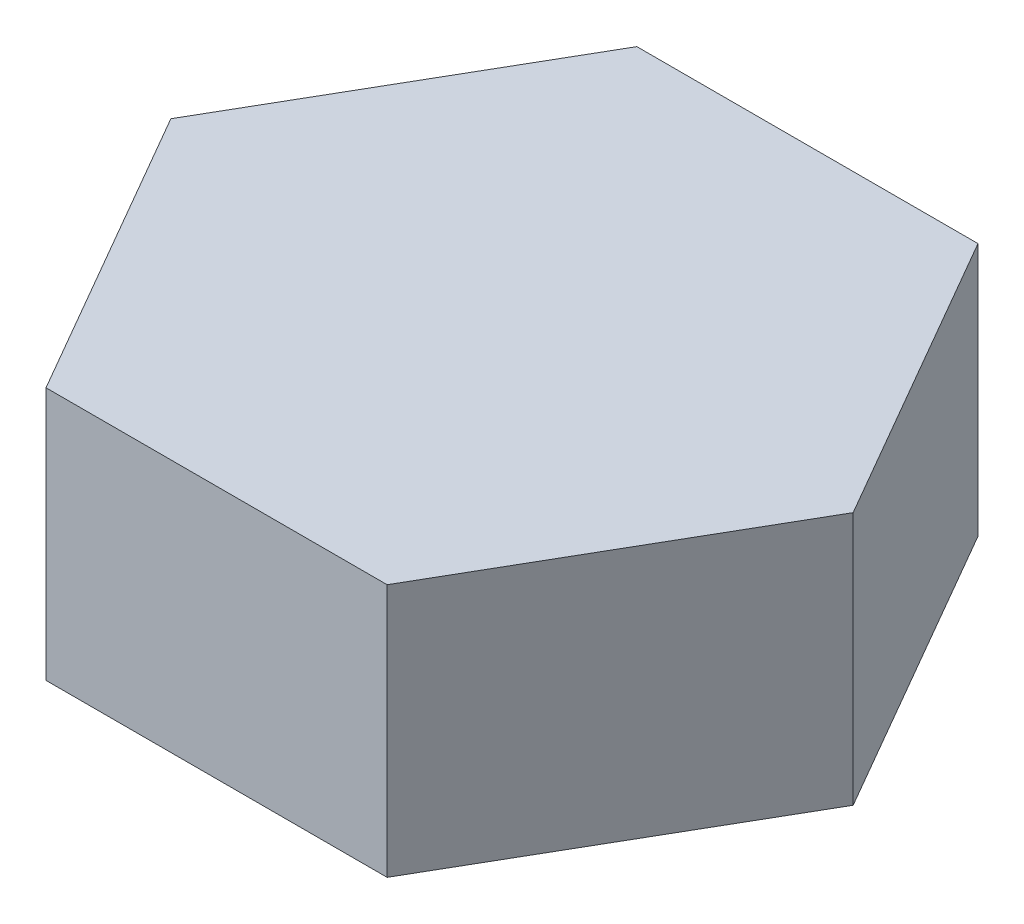
ISO-10303-21;
HEADER;
FILE_DESCRIPTION(('STEP AP214'),'2;1');
FILE_NAME('part.step','',(''),(''),'','','');
FILE_SCHEMA(('AUTOMOTIVE_DESIGN { 1 0 10303 214 1 1 1 1 }'));
ENDSEC;
DATA;
#1=APPLICATION_CONTEXT('core data for automotive mechanical design processes');
#2=APPLICATION_PROTOCOL_DEFINITION('international standard','automotive_design',2000,#1);
#3=PRODUCT_CONTEXT('',#1,'mechanical');
#4=PRODUCT('Part','Part','',(#3));
#5=PRODUCT_RELATED_PRODUCT_CATEGORY('part','',(#4));
#6=PRODUCT_DEFINITION_FORMATION('','',#4);
#7=PRODUCT_DEFINITION_CONTEXT('part definition',#1,'design');
#8=PRODUCT_DEFINITION('design','',#6,#7);
#9=PRODUCT_DEFINITION_SHAPE('','',#8);
#10=(LENGTH_UNIT() NAMED_UNIT(*) SI_UNIT(.MILLI.,.METRE.));
#11=(NAMED_UNIT(*) PLANE_ANGLE_UNIT() SI_UNIT($,.RADIAN.));
#12=(NAMED_UNIT(*) SI_UNIT($,.STERADIAN.) SOLID_ANGLE_UNIT());
#13=UNCERTAINTY_MEASURE_WITH_UNIT(LENGTH_MEASURE(1.E-05),#10,'distance_accuracy_value','');
#14=(GEOMETRIC_REPRESENTATION_CONTEXT(3) GLOBAL_UNCERTAINTY_ASSIGNED_CONTEXT((#13)) GLOBAL_UNIT_ASSIGNED_CONTEXT((#10,
#11,#12)) REPRESENTATION_CONTEXT('',''));
#15=CARTESIAN_POINT('',(0.,0.,0.));
#16=DIRECTION('',(0.,0.,1.));
#17=DIRECTION('',(1.,0.,0.));
#18=AXIS2_PLACEMENT_3D('',#15,#16,#17);
#19=CARTESIAN_POINT('',(-20.1899389135616,30.,-34.9699999999998));
#20=DIRECTION('',(0.866025403784442,0.,0.499999999999995));
#21=DIRECTION('',(0.499999999999995,0.,-0.866025403784442));
#22=AXIS2_PLACEMENT_3D('',#19,#20,#21);
#23=PLANE('',#22);
#24=DIRECTION('',(-0.499999999999995,0.,0.866025403784442));
#25=VECTOR('',#24,1.);
#26=CARTESIAN_POINT('',(-20.1899389135616,0.,-34.9699999999998));
#27=LINE('',#26,#25);
#28=CARTESIAN_POINT('',(-20.1899389135616,0.,-34.9699999999998));
#29=VERTEX_POINT('',#28);
#30=CARTESIAN_POINT('',(-40.3798778271225,0.,0.));
#31=VERTEX_POINT('',#30);
#32=EDGE_CURVE('E128',#29,#31,#27,.T.);
#33=ORIENTED_EDGE('',*,*,#32,.T.);
#34=DIRECTION('',(0.,-1.,0.));
#35=VECTOR('',#34,1.);
#36=CARTESIAN_POINT('',(-40.3798778271225,30.,0.));
#37=LINE('',#36,#35);
#38=CARTESIAN_POINT('',(-40.3798778271225,30.,0.));
#39=VERTEX_POINT('',#38);
#40=EDGE_CURVE('E11',#39,#31,#37,.T.);
#41=ORIENTED_EDGE('',*,*,#40,.F.);
#42=DIRECTION('',(-0.499999999999995,0.,0.866025403784442));
#43=VECTOR('',#42,1.);
#44=CARTESIAN_POINT('',(-20.1899389135616,30.,-34.9699999999998));
#45=LINE('',#44,#43);
#46=CARTESIAN_POINT('',(-20.1899389135616,30.,-34.9699999999998));
#47=VERTEX_POINT('',#46);
#48=EDGE_CURVE('E144',#47,#39,#45,.T.);
#49=ORIENTED_EDGE('',*,*,#48,.F.);
#50=DIRECTION('',(0.,-1.,0.));
#51=VECTOR('',#50,1.);
#52=CARTESIAN_POINT('',(-20.1899389135616,30.,-34.9699999999998));
#53=LINE('',#52,#51);
#54=EDGE_CURVE('E124',#47,#29,#53,.T.);
#55=ORIENTED_EDGE('',*,*,#54,.T.);
#56=EDGE_LOOP('',(#33,#41,#49,#55));
#57=FACE_BOUND('',#56,.T.);
#58=ADVANCED_FACE('F39',(#57),#23,.F.);
#59=CARTESIAN_POINT('',(-40.3798778271225,30.,0.));
#60=DIRECTION('',(0.866025403784438,0.,-0.500000000000001));
#61=DIRECTION('',(-0.500000000000001,0.,-0.866025403784438));
#62=AXIS2_PLACEMENT_3D('',#59,#60,#61);
#63=PLANE('',#62);
#64=DIRECTION('',(0.500000000000001,0.,0.866025403784438));
#65=VECTOR('',#64,1.);
#66=CARTESIAN_POINT('',(-40.3798778271225,0.,0.));
#67=LINE('',#66,#65);
#68=CARTESIAN_POINT('',(-20.1899389135612,0.,34.9700000000001));
#69=VERTEX_POINT('',#68);
#70=EDGE_CURVE('E132',#31,#69,#67,.T.);
#71=ORIENTED_EDGE('',*,*,#70,.T.);
#72=DIRECTION('',(0.,-1.,0.));
#73=VECTOR('',#72,1.);
#74=CARTESIAN_POINT('',(-20.1899389135612,30.,34.9700000000001));
#75=LINE('',#74,#73);
#76=CARTESIAN_POINT('',(-20.1899389135612,30.,34.9700000000001));
#77=VERTEX_POINT('',#76);
#78=EDGE_CURVE('E48',#77,#69,#75,.T.);
#79=ORIENTED_EDGE('',*,*,#78,.F.);
#80=DIRECTION('',(0.500000000000001,0.,0.866025403784438));
#81=VECTOR('',#80,1.);
#82=CARTESIAN_POINT('',(-40.3798778271225,30.,0.));
#83=LINE('',#82,#81);
#84=EDGE_CURVE('E93',#39,#77,#83,.T.);
#85=ORIENTED_EDGE('',*,*,#84,.F.);
#86=ORIENTED_EDGE('',*,*,#40,.T.);
#87=EDGE_LOOP('',(#71,#79,#85,#86));
#88=FACE_BOUND('',#87,.T.);
#89=ADVANCED_FACE('F172',(#88),#63,.F.);
#90=CARTESIAN_POINT('',(-20.1899389135612,30.,34.9700000000001));
#91=DIRECTION('',(0.,0.,-1.));
#92=DIRECTION('',(-1.,0.,0.));
#93=AXIS2_PLACEMENT_3D('',#90,#91,#92);
#94=PLANE('',#93);
#95=DIRECTION('',(1.,0.,0.));
#96=VECTOR('',#95,1.);
#97=CARTESIAN_POINT('',(-20.1899389135612,0.,34.9700000000001));
#98=LINE('',#97,#96);
#99=CARTESIAN_POINT('',(20.1899389135614,0.,34.9699999999999));
#100=VERTEX_POINT('',#99);
#101=EDGE_CURVE('E135',#69,#100,#98,.T.);
#102=ORIENTED_EDGE('',*,*,#101,.T.);
#103=DIRECTION('',(0.,-1.,0.));
#104=VECTOR('',#103,1.);
#105=CARTESIAN_POINT('',(20.1899389135614,30.,34.9699999999999));
#106=LINE('',#105,#104);
#107=CARTESIAN_POINT('',(20.1899389135614,30.,34.9699999999999));
#108=VERTEX_POINT('',#107);
#109=EDGE_CURVE('E117',#108,#100,#106,.T.);
#110=ORIENTED_EDGE('',*,*,#109,.F.);
#111=DIRECTION('',(1.,0.,0.));
#112=VECTOR('',#111,1.);
#113=CARTESIAN_POINT('',(-20.1899389135612,30.,34.9700000000001));
#114=LINE('',#113,#112);
#115=EDGE_CURVE('E106',#77,#108,#114,.T.);
#116=ORIENTED_EDGE('',*,*,#115,.F.);
#117=ORIENTED_EDGE('',*,*,#78,.T.);
#118=EDGE_LOOP('',(#102,#110,#116,#117));
#119=FACE_BOUND('',#118,.T.);
#120=ADVANCED_FACE('F154',(#119),#94,.F.);
#121=CARTESIAN_POINT('',(20.1899389135614,30.,34.9699999999999));
#122=DIRECTION('',(-0.866025403784441,0.,-0.499999999999995));
#123=DIRECTION('',(-0.499999999999995,0.,0.866025403784442));
#124=AXIS2_PLACEMENT_3D('',#121,#122,#123);
#125=PLANE('',#124);
#126=DIRECTION('',(0.499999999999995,0.,-0.866025403784442));
#127=VECTOR('',#126,1.);
#128=CARTESIAN_POINT('',(20.1899389135614,0.,34.9699999999999));
#129=LINE('',#128,#127);
#130=CARTESIAN_POINT('',(40.3798778271225,0.,-2.81971179796327E-13));
#131=VERTEX_POINT('',#130);
#132=EDGE_CURVE('E115',#100,#131,#129,.T.);
#133=ORIENTED_EDGE('',*,*,#132,.T.);
#134=DIRECTION('',(0.,-1.,0.));
#135=VECTOR('',#134,1.);
#136=CARTESIAN_POINT('',(40.3798778271225,30.,-2.81971179796327E-13));
#137=LINE('',#136,#135);
#138=CARTESIAN_POINT('',(40.3798778271225,30.,-2.81971179796327E-13));
#139=VERTEX_POINT('',#138);
#140=EDGE_CURVE('E112',#139,#131,#137,.T.);
#141=ORIENTED_EDGE('',*,*,#140,.F.);
#142=DIRECTION('',(0.499999999999995,0.,-0.866025403784442));
#143=VECTOR('',#142,1.);
#144=CARTESIAN_POINT('',(20.1899389135614,30.,34.9699999999999));
#145=LINE('',#144,#143);
#146=EDGE_CURVE('E100',#108,#139,#145,.T.);
#147=ORIENTED_EDGE('',*,*,#146,.F.);
#148=ORIENTED_EDGE('',*,*,#109,.T.);
#149=EDGE_LOOP('',(#133,#141,#147,#148));
#150=FACE_BOUND('',#149,.T.);
#151=ADVANCED_FACE('F113',(#150),#125,.F.);
#152=CARTESIAN_POINT('',(40.3798778271225,30.,-2.81971179796327E-13));
#153=DIRECTION('',(-0.866025403784434,0.,0.500000000000007));
#154=DIRECTION('',(0.500000000000007,0.,0.866025403784435));
#155=AXIS2_PLACEMENT_3D('',#152,#153,#154);
#156=PLANE('',#155);
#157=DIRECTION('',(-0.500000000000007,0.,-0.866025403784435));
#158=VECTOR('',#157,1.);
#159=CARTESIAN_POINT('',(40.3798778271225,0.,-2.81971179796327E-13));
#160=LINE('',#159,#158);
#161=CARTESIAN_POINT('',(20.1899389135609,0.,-34.9700000000002));
#162=VERTEX_POINT('',#161);
#163=EDGE_CURVE('E79',#131,#162,#160,.T.);
#164=ORIENTED_EDGE('',*,*,#163,.T.);
#165=DIRECTION('',(0.,-1.,0.));
#166=VECTOR('',#165,1.);
#167=CARTESIAN_POINT('',(20.1899389135609,30.,-34.9700000000002));
#168=LINE('',#167,#166);
#169=CARTESIAN_POINT('',(20.1899389135609,30.,-34.9700000000002));
#170=VERTEX_POINT('',#169);
#171=EDGE_CURVE('E118',#170,#162,#168,.T.);
#172=ORIENTED_EDGE('',*,*,#171,.F.);
#173=DIRECTION('',(-0.500000000000007,0.,-0.866025403784435));
#174=VECTOR('',#173,1.);
#175=CARTESIAN_POINT('',(40.3798778271225,30.,-2.81971179796327E-13));
#176=LINE('',#175,#174);
#177=EDGE_CURVE('E104',#139,#170,#176,.T.);
#178=ORIENTED_EDGE('',*,*,#177,.F.);
#179=ORIENTED_EDGE('',*,*,#140,.T.);
#180=EDGE_LOOP('',(#164,#172,#178,#179));
#181=FACE_BOUND('',#180,.T.);
#182=ADVANCED_FACE('F120',(#181),#156,.F.);
#183=CARTESIAN_POINT('',(20.1899389135609,30.,-34.9700000000002));
#184=DIRECTION('',(0.,0.,1.));
#185=DIRECTION('',(1.,0.,0.));
#186=AXIS2_PLACEMENT_3D('',#183,#184,#185);
#187=PLANE('',#186);
#188=DIRECTION('',(-1.,0.,0.));
#189=VECTOR('',#188,1.);
#190=CARTESIAN_POINT('',(20.1899389135609,0.,-34.9700000000002));
#191=LINE('',#190,#189);
#192=EDGE_CURVE('E85',#162,#29,#191,.T.);
#193=ORIENTED_EDGE('',*,*,#192,.T.);
#194=ORIENTED_EDGE('',*,*,#54,.F.);
#195=DIRECTION('',(-1.,0.,0.));
#196=VECTOR('',#195,1.);
#197=CARTESIAN_POINT('',(20.1899389135609,30.,-34.9700000000002));
#198=LINE('',#197,#196);
#199=EDGE_CURVE('E56',#170,#47,#198,.T.);
#200=ORIENTED_EDGE('',*,*,#199,.F.);
#201=ORIENTED_EDGE('',*,*,#171,.T.);
#202=EDGE_LOOP('',(#193,#194,#200,#201));
#203=FACE_BOUND('',#202,.T.);
#204=ADVANCED_FACE('F161',(#203),#187,.F.);
#205=CARTESIAN_POINT('',(0.,30.,0.));
#206=DIRECTION('',(0.,1.,0.));
#207=DIRECTION('',(0.,0.,1.));
#208=AXIS2_PLACEMENT_3D('',#205,#206,#207);
#209=PLANE('',#208);
#210=ORIENTED_EDGE('',*,*,#48,.T.);
#211=ORIENTED_EDGE('',*,*,#84,.T.);
#212=ORIENTED_EDGE('',*,*,#115,.T.);
#213=ORIENTED_EDGE('',*,*,#146,.T.);
#214=ORIENTED_EDGE('',*,*,#177,.T.);
#215=ORIENTED_EDGE('',*,*,#199,.T.);
#216=EDGE_LOOP('',(#210,#211,#212,#213,#214,#215));
#217=FACE_BOUND('',#216,.T.);
#218=ADVANCED_FACE('F102',(#217),#209,.T.);
#219=CARTESIAN_POINT('',(0.,0.,0.));
#220=DIRECTION('',(0.,1.,0.));
#221=DIRECTION('',(0.,0.,1.));
#222=AXIS2_PLACEMENT_3D('',#219,#220,#221);
#223=PLANE('',#222);
#224=ORIENTED_EDGE('',*,*,#32,.F.);
#225=ORIENTED_EDGE('',*,*,#192,.F.);
#226=ORIENTED_EDGE('',*,*,#163,.F.);
#227=ORIENTED_EDGE('',*,*,#132,.F.);
#228=ORIENTED_EDGE('',*,*,#101,.F.);
#229=ORIENTED_EDGE('',*,*,#70,.F.);
#230=EDGE_LOOP('',(#224,#225,#226,#227,#228,#229));
#231=FACE_BOUND('',#230,.T.);
#232=ADVANCED_FACE('F157',(#231),#223,.F.);
#233=CLOSED_SHELL('',(#58,#89,#120,#151,#182,#204,#218,#232));
#234=MANIFOLD_SOLID_BREP('B2',#233);
#235=ADVANCED_BREP_SHAPE_REPRESENTATION('',(#18,#234),#14);
#236=SHAPE_DEFINITION_REPRESENTATION(#9,#235);
ENDSEC;
END-ISO-10303-21;
